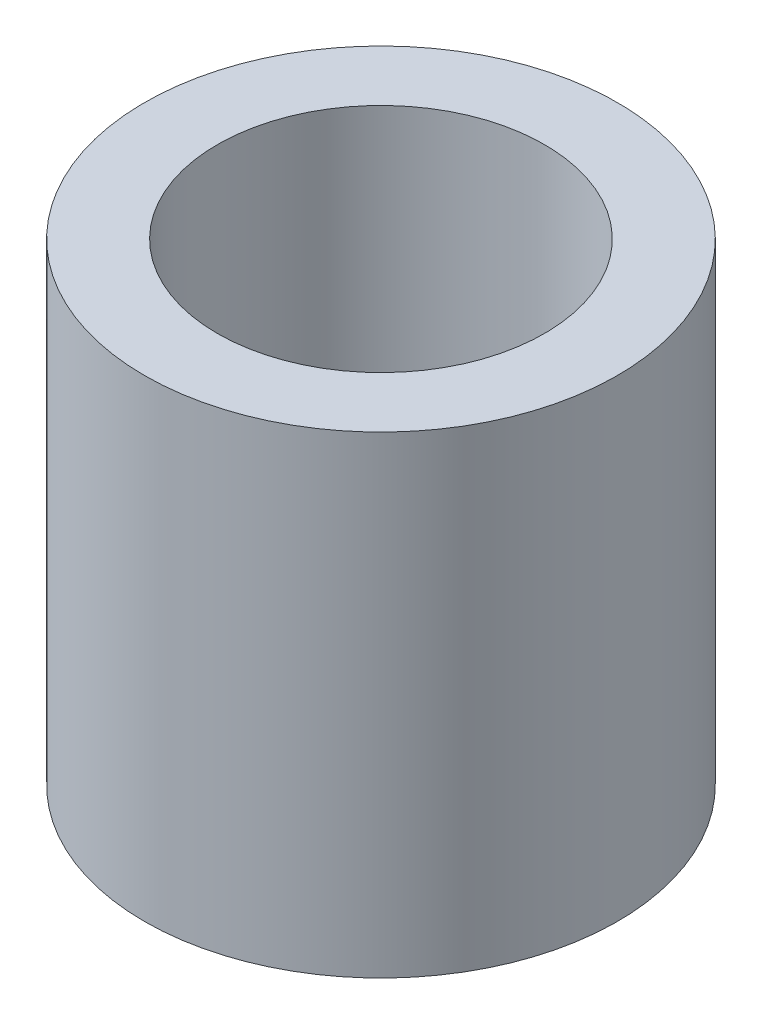
ISO-10303-21;
HEADER;
FILE_DESCRIPTION(('STEP AP214'),'2;1');
FILE_NAME('part.step','',(''),(''),'','','');
FILE_SCHEMA(('AUTOMOTIVE_DESIGN { 1 0 10303 214 1 1 1 1 }'));
ENDSEC;
DATA;
#1=APPLICATION_CONTEXT('core data for automotive mechanical design processes');
#2=APPLICATION_PROTOCOL_DEFINITION('international standard','automotive_design',2000,#1);
#3=PRODUCT_CONTEXT('',#1,'mechanical');
#4=PRODUCT('Part','Part','',(#3));
#5=PRODUCT_RELATED_PRODUCT_CATEGORY('part','',(#4));
#6=PRODUCT_DEFINITION_FORMATION('','',#4);
#7=PRODUCT_DEFINITION_CONTEXT('part definition',#1,'design');
#8=PRODUCT_DEFINITION('design','',#6,#7);
#9=PRODUCT_DEFINITION_SHAPE('','',#8);
#10=(LENGTH_UNIT() NAMED_UNIT(*) SI_UNIT(.MILLI.,.METRE.));
#11=(NAMED_UNIT(*) PLANE_ANGLE_UNIT() SI_UNIT($,.RADIAN.));
#12=(NAMED_UNIT(*) SI_UNIT($,.STERADIAN.) SOLID_ANGLE_UNIT());
#13=UNCERTAINTY_MEASURE_WITH_UNIT(LENGTH_MEASURE(1.E-05),#10,'distance_accuracy_value','');
#14=(GEOMETRIC_REPRESENTATION_CONTEXT(3) GLOBAL_UNCERTAINTY_ASSIGNED_CONTEXT((#13)) GLOBAL_UNIT_ASSIGNED_CONTEXT((#10,
#11,#12)) REPRESENTATION_CONTEXT('',''));
#15=CARTESIAN_POINT('',(0.,0.,0.));
#16=DIRECTION('',(0.,0.,1.));
#17=DIRECTION('',(1.,0.,0.));
#18=AXIS2_PLACEMENT_3D('',#15,#16,#17);
#19=CARTESIAN_POINT('',(0.,50.,0.));
#20=DIRECTION('',(0.,1.,0.));
#21=DIRECTION('',(0.,0.,1.));
#22=AXIS2_PLACEMENT_3D('',#19,#20,#21);
#23=PLANE('',#22);
#24=CARTESIAN_POINT('',(0.,50.,0.));
#25=DIRECTION('',(0.,1.,0.));
#26=DIRECTION('',(0.,0.,1.));
#27=AXIS2_PLACEMENT_3D('',#24,#25,#26);
#28=CIRCLE('',#27,25.);
#29=CARTESIAN_POINT('',(0.,50.,25.));
#30=VERTEX_POINT('',#29);
#31=EDGE_CURVE('E10',#30,#30,#28,.T.);
#32=ORIENTED_EDGE('',*,*,#31,.T.);
#33=EDGE_LOOP('',(#32));
#34=FACE_BOUND('',#33,.T.);
#35=CARTESIAN_POINT('',(0.,50.,0.));
#36=DIRECTION('',(0.,1.,0.));
#37=DIRECTION('',(0.,0.,1.));
#38=AXIS2_PLACEMENT_3D('',#35,#36,#37);
#39=CIRCLE('',#38,17.3);
#40=CARTESIAN_POINT('',(0.,50.,17.3));
#41=VERTEX_POINT('',#40);
#42=EDGE_CURVE('E42',#41,#41,#39,.T.);
#43=ORIENTED_EDGE('',*,*,#42,.F.);
#44=EDGE_LOOP('',(#43));
#45=FACE_BOUND('',#44,.T.);
#46=ADVANCED_FACE('F31',(#34,#45),#23,.T.);
#47=CARTESIAN_POINT('',(0.,0.,0.));
#48=DIRECTION('',(0.,1.,0.));
#49=DIRECTION('',(0.,0.,1.));
#50=AXIS2_PLACEMENT_3D('',#47,#48,#49);
#51=PLANE('',#50);
#52=CARTESIAN_POINT('',(0.,0.,0.));
#53=DIRECTION('',(0.,1.,0.));
#54=DIRECTION('',(0.,0.,1.));
#55=AXIS2_PLACEMENT_3D('',#52,#53,#54);
#56=CIRCLE('',#55,25.);
#57=CARTESIAN_POINT('',(0.,0.,25.));
#58=VERTEX_POINT('',#57);
#59=EDGE_CURVE('E35',#58,#58,#56,.T.);
#60=ORIENTED_EDGE('',*,*,#59,.F.);
#61=EDGE_LOOP('',(#60));
#62=FACE_BOUND('',#61,.T.);
#63=CARTESIAN_POINT('',(0.,0.,0.));
#64=DIRECTION('',(0.,1.,0.));
#65=DIRECTION('',(0.,0.,1.));
#66=AXIS2_PLACEMENT_3D('',#63,#64,#65);
#67=CIRCLE('',#66,17.3);
#68=CARTESIAN_POINT('',(0.,0.,17.3));
#69=VERTEX_POINT('',#68);
#70=EDGE_CURVE('E44',#69,#69,#67,.T.);
#71=ORIENTED_EDGE('',*,*,#70,.T.);
#72=EDGE_LOOP('',(#71));
#73=FACE_BOUND('',#72,.T.);
#74=ADVANCED_FACE('F54',(#62,#73),#51,.F.);
#75=CARTESIAN_POINT('',(0.,50.,0.));
#76=DIRECTION('',(0.,-1.,0.));
#77=DIRECTION('',(0.,0.,-1.));
#78=AXIS2_PLACEMENT_3D('',#75,#76,#77);
#79=CYLINDRICAL_SURFACE('',#78,25.);
#80=ORIENTED_EDGE('',*,*,#31,.F.);
#81=EDGE_LOOP('',(#80));
#82=FACE_BOUND('',#81,.T.);
#83=ORIENTED_EDGE('',*,*,#59,.T.);
#84=EDGE_LOOP('',(#83));
#85=FACE_BOUND('',#84,.T.);
#86=ADVANCED_FACE('F33',(#82,#85),#79,.T.);
#87=CARTESIAN_POINT('',(0.,50.,0.));
#88=DIRECTION('',(0.,-1.,0.));
#89=DIRECTION('',(0.,0.,-1.));
#90=AXIS2_PLACEMENT_3D('',#87,#88,#89);
#91=CYLINDRICAL_SURFACE('',#90,17.3);
#92=ORIENTED_EDGE('',*,*,#42,.T.);
#93=EDGE_LOOP('',(#92));
#94=FACE_BOUND('',#93,.T.);
#95=ORIENTED_EDGE('',*,*,#70,.F.);
#96=EDGE_LOOP('',(#95));
#97=FACE_BOUND('',#96,.T.);
#98=ADVANCED_FACE('F50',(#94,#97),#91,.F.);
#99=CLOSED_SHELL('',(#46,#74,#86,#98));
#100=MANIFOLD_SOLID_BREP('B2',#99);
#101=ADVANCED_BREP_SHAPE_REPRESENTATION('',(#18,#100),#14);
#102=SHAPE_DEFINITION_REPRESENTATION(#9,#101);
ENDSEC;
END-ISO-10303-21;
